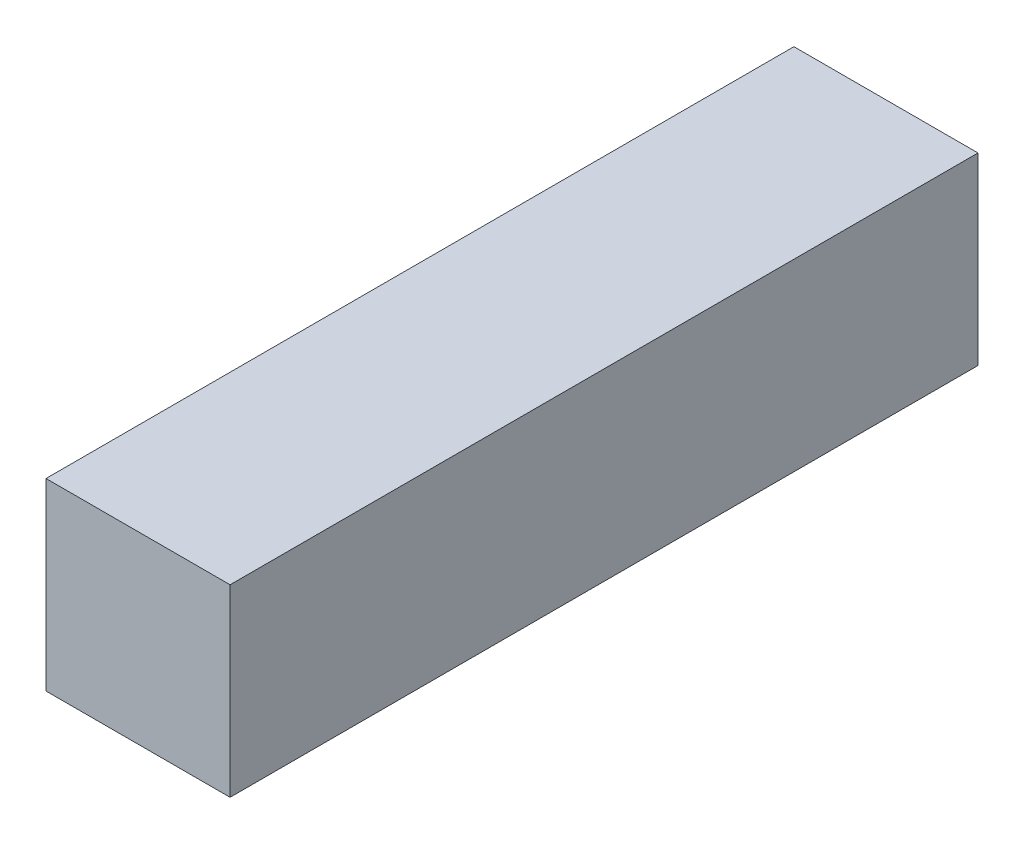
ISO-10303-21;
HEADER;
FILE_DESCRIPTION(('STEP AP214'),'2;1');
FILE_NAME('part.step','',(''),(''),'','','');
FILE_SCHEMA(('AUTOMOTIVE_DESIGN { 1 0 10303 214 1 1 1 1 }'));
ENDSEC;
DATA;
#1=APPLICATION_CONTEXT('core data for automotive mechanical design processes');
#2=APPLICATION_PROTOCOL_DEFINITION('international standard','automotive_design',2000,#1);
#3=PRODUCT_CONTEXT('',#1,'mechanical');
#4=PRODUCT('Part','Part','',(#3));
#5=PRODUCT_RELATED_PRODUCT_CATEGORY('part','',(#4));
#6=PRODUCT_DEFINITION_FORMATION('','',#4);
#7=PRODUCT_DEFINITION_CONTEXT('part definition',#1,'design');
#8=PRODUCT_DEFINITION('design','',#6,#7);
#9=PRODUCT_DEFINITION_SHAPE('','',#8);
#10=(LENGTH_UNIT() NAMED_UNIT(*) SI_UNIT(.MILLI.,.METRE.));
#11=(NAMED_UNIT(*) PLANE_ANGLE_UNIT() SI_UNIT($,.RADIAN.));
#12=(NAMED_UNIT(*) SI_UNIT($,.STERADIAN.) SOLID_ANGLE_UNIT());
#13=UNCERTAINTY_MEASURE_WITH_UNIT(LENGTH_MEASURE(1.E-05),#10,'distance_accuracy_value','');
#14=(GEOMETRIC_REPRESENTATION_CONTEXT(3) GLOBAL_UNCERTAINTY_ASSIGNED_CONTEXT((#13)) GLOBAL_UNIT_ASSIGNED_CONTEXT((#10,
#11,#12)) REPRESENTATION_CONTEXT('',''));
#15=CARTESIAN_POINT('',(0.,0.,0.));
#16=DIRECTION('',(0.,0.,1.));
#17=DIRECTION('',(1.,0.,0.));
#18=AXIS2_PLACEMENT_3D('',#15,#16,#17);
#19=CARTESIAN_POINT('',(2.46,-2.46,19.99));
#20=DIRECTION('',(-1.,0.,0.));
#21=DIRECTION('',(0.,0.,1.));
#22=AXIS2_PLACEMENT_3D('',#19,#20,#21);
#23=PLANE('',#22);
#24=DIRECTION('',(0.,1.,0.));
#25=VECTOR('',#24,1.);
#26=CARTESIAN_POINT('',(2.46,-2.46,0.));
#27=LINE('',#26,#25);
#28=CARTESIAN_POINT('',(2.46,-2.46,0.));
#29=VERTEX_POINT('',#28);
#30=CARTESIAN_POINT('',(2.46,2.46,0.));
#31=VERTEX_POINT('',#30);
#32=EDGE_CURVE('E111',#29,#31,#27,.T.);
#33=ORIENTED_EDGE('',*,*,#32,.T.);
#34=DIRECTION('',(0.,0.,-1.));
#35=VECTOR('',#34,1.);
#36=CARTESIAN_POINT('',(2.46,2.46,19.99));
#37=LINE('',#36,#35);
#38=CARTESIAN_POINT('',(2.46,2.46,19.99));
#39=VERTEX_POINT('',#38);
#40=EDGE_CURVE('E11',#39,#31,#37,.T.);
#41=ORIENTED_EDGE('',*,*,#40,.F.);
#42=DIRECTION('',(0.,1.,0.));
#43=VECTOR('',#42,1.);
#44=CARTESIAN_POINT('',(2.46,-2.46,19.99));
#45=LINE('',#44,#43);
#46=CARTESIAN_POINT('',(2.46,-2.46,19.99));
#47=VERTEX_POINT('',#46);
#48=EDGE_CURVE('E95',#47,#39,#45,.T.);
#49=ORIENTED_EDGE('',*,*,#48,.F.);
#50=DIRECTION('',(0.,0.,-1.));
#51=VECTOR('',#50,1.);
#52=CARTESIAN_POINT('',(2.46,-2.46,19.99));
#53=LINE('',#52,#51);
#54=EDGE_CURVE('E107',#47,#29,#53,.T.);
#55=ORIENTED_EDGE('',*,*,#54,.T.);
#56=EDGE_LOOP('',(#33,#41,#49,#55));
#57=FACE_BOUND('',#56,.T.);
#58=ADVANCED_FACE('F43',(#57),#23,.F.);
#59=CARTESIAN_POINT('',(-2.46,2.46,19.99));
#60=DIRECTION('',(0.,-1.,0.));
#61=DIRECTION('',(0.,0.,-1.));
#62=AXIS2_PLACEMENT_3D('',#59,#60,#61);
#63=PLANE('',#62);
#64=DIRECTION('',(-1.,0.,0.));
#65=VECTOR('',#64,1.);
#66=CARTESIAN_POINT('',(-2.46,2.46,0.));
#67=LINE('',#66,#65);
#68=CARTESIAN_POINT('',(-2.46,2.46,0.));
#69=VERTEX_POINT('',#68);
#70=EDGE_CURVE('E100',#31,#69,#67,.T.);
#71=ORIENTED_EDGE('',*,*,#70,.T.);
#72=DIRECTION('',(0.,0.,-1.));
#73=VECTOR('',#72,1.);
#74=CARTESIAN_POINT('',(-2.46,2.46,19.99));
#75=LINE('',#74,#73);
#76=CARTESIAN_POINT('',(-2.46,2.46,19.99));
#77=VERTEX_POINT('',#76);
#78=EDGE_CURVE('E52',#77,#69,#75,.T.);
#79=ORIENTED_EDGE('',*,*,#78,.F.);
#80=DIRECTION('',(-1.,0.,0.));
#81=VECTOR('',#80,1.);
#82=CARTESIAN_POINT('',(-2.46,2.46,19.99));
#83=LINE('',#82,#81);
#84=EDGE_CURVE('E90',#39,#77,#83,.T.);
#85=ORIENTED_EDGE('',*,*,#84,.F.);
#86=ORIENTED_EDGE('',*,*,#40,.T.);
#87=EDGE_LOOP('',(#71,#79,#85,#86));
#88=FACE_BOUND('',#87,.T.);
#89=ADVANCED_FACE('F99',(#88),#63,.F.);
#90=CARTESIAN_POINT('',(-2.46,-2.46,19.99));
#91=DIRECTION('',(1.,0.,0.));
#92=DIRECTION('',(0.,0.,-1.));
#93=AXIS2_PLACEMENT_3D('',#90,#91,#92);
#94=PLANE('',#93);
#95=DIRECTION('',(0.,-1.,0.));
#96=VECTOR('',#95,1.);
#97=CARTESIAN_POINT('',(-2.46,-2.46,0.));
#98=LINE('',#97,#96);
#99=CARTESIAN_POINT('',(-2.46,-2.46,0.));
#100=VERTEX_POINT('',#99);
#101=EDGE_CURVE('E77',#69,#100,#98,.T.);
#102=ORIENTED_EDGE('',*,*,#101,.T.);
#103=DIRECTION('',(0.,0.,-1.));
#104=VECTOR('',#103,1.);
#105=CARTESIAN_POINT('',(-2.46,-2.46,19.99));
#106=LINE('',#105,#104);
#107=CARTESIAN_POINT('',(-2.46,-2.46,19.99));
#108=VERTEX_POINT('',#107);
#109=EDGE_CURVE('E102',#108,#100,#106,.T.);
#110=ORIENTED_EDGE('',*,*,#109,.F.);
#111=DIRECTION('',(0.,-1.,0.));
#112=VECTOR('',#111,1.);
#113=CARTESIAN_POINT('',(-2.46,-2.46,19.99));
#114=LINE('',#113,#112);
#115=EDGE_CURVE('E93',#77,#108,#114,.T.);
#116=ORIENTED_EDGE('',*,*,#115,.F.);
#117=ORIENTED_EDGE('',*,*,#78,.T.);
#118=EDGE_LOOP('',(#102,#110,#116,#117));
#119=FACE_BOUND('',#118,.T.);
#120=ADVANCED_FACE('F103',(#119),#94,.F.);
#121=CARTESIAN_POINT('',(-2.46,-2.46,19.99));
#122=DIRECTION('',(0.,1.,0.));
#123=DIRECTION('',(0.,0.,1.));
#124=AXIS2_PLACEMENT_3D('',#121,#122,#123);
#125=PLANE('',#124);
#126=DIRECTION('',(1.,0.,0.));
#127=VECTOR('',#126,1.);
#128=CARTESIAN_POINT('',(-2.46,-2.46,0.));
#129=LINE('',#128,#127);
#130=EDGE_CURVE('E83',#100,#29,#129,.T.);
#131=ORIENTED_EDGE('',*,*,#130,.T.);
#132=ORIENTED_EDGE('',*,*,#54,.F.);
#133=DIRECTION('',(1.,0.,0.));
#134=VECTOR('',#133,1.);
#135=CARTESIAN_POINT('',(-2.46,-2.46,19.99));
#136=LINE('',#135,#134);
#137=EDGE_CURVE('E60',#108,#47,#136,.T.);
#138=ORIENTED_EDGE('',*,*,#137,.F.);
#139=ORIENTED_EDGE('',*,*,#109,.T.);
#140=EDGE_LOOP('',(#131,#132,#138,#139));
#141=FACE_BOUND('',#140,.T.);
#142=ADVANCED_FACE('F124',(#141),#125,.F.);
#143=CARTESIAN_POINT('',(0.,0.,19.99));
#144=DIRECTION('',(0.,0.,-1.));
#145=DIRECTION('',(-1.,0.,0.));
#146=AXIS2_PLACEMENT_3D('',#143,#144,#145);
#147=PLANE('',#146);
#148=ORIENTED_EDGE('',*,*,#48,.T.);
#149=ORIENTED_EDGE('',*,*,#84,.T.);
#150=ORIENTED_EDGE('',*,*,#115,.T.);
#151=ORIENTED_EDGE('',*,*,#137,.T.);
#152=EDGE_LOOP('',(#148,#149,#150,#151));
#153=FACE_BOUND('',#152,.T.);
#154=ADVANCED_FACE('F91',(#153),#147,.F.);
#155=CARTESIAN_POINT('',(0.,0.,0.));
#156=DIRECTION('',(0.,0.,-1.));
#157=DIRECTION('',(-1.,0.,0.));
#158=AXIS2_PLACEMENT_3D('',#155,#156,#157);
#159=PLANE('',#158);
#160=ORIENTED_EDGE('',*,*,#32,.F.);
#161=ORIENTED_EDGE('',*,*,#130,.F.);
#162=ORIENTED_EDGE('',*,*,#101,.F.);
#163=ORIENTED_EDGE('',*,*,#70,.F.);
#164=EDGE_LOOP('',(#160,#161,#162,#163));
#165=FACE_BOUND('',#164,.T.);
#166=ADVANCED_FACE('F127',(#165),#159,.T.);
#167=CLOSED_SHELL('',(#58,#89,#120,#142,#154,#166));
#168=MANIFOLD_SOLID_BREP('B2',#167);
#169=ADVANCED_BREP_SHAPE_REPRESENTATION('',(#18,#168),#14);
#170=SHAPE_DEFINITION_REPRESENTATION(#9,#169);
ENDSEC;
END-ISO-10303-21;
